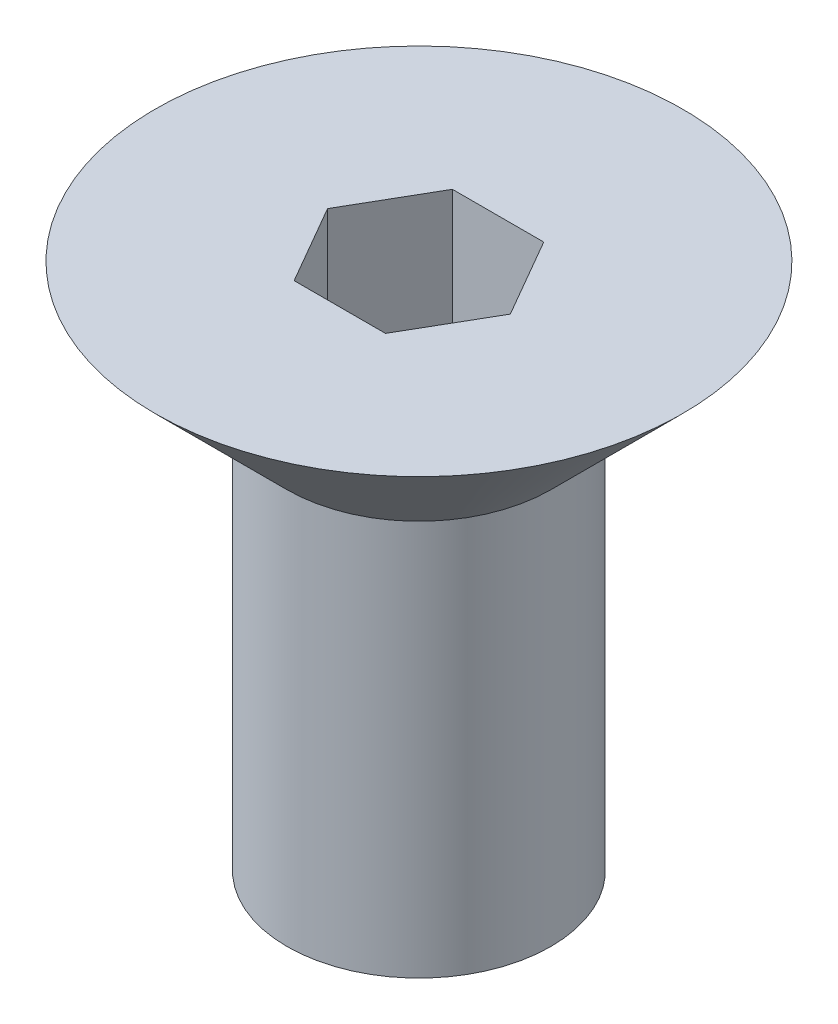
ISO-10303-21;
HEADER;
FILE_DESCRIPTION(('STEP AP214'),'2;1');
FILE_NAME('part.step','',(''),(''),'','','');
FILE_SCHEMA(('AUTOMOTIVE_DESIGN { 1 0 10303 214 1 1 1 1 }'));
ENDSEC;
DATA;
#1=APPLICATION_CONTEXT('core data for automotive mechanical design processes');
#2=APPLICATION_PROTOCOL_DEFINITION('international standard','automotive_design',2000,#1);
#3=PRODUCT_CONTEXT('',#1,'mechanical');
#4=PRODUCT('Part','Part','',(#3));
#5=PRODUCT_RELATED_PRODUCT_CATEGORY('part','',(#4));
#6=PRODUCT_DEFINITION_FORMATION('','',#4);
#7=PRODUCT_DEFINITION_CONTEXT('part definition',#1,'design');
#8=PRODUCT_DEFINITION('design','',#6,#7);
#9=PRODUCT_DEFINITION_SHAPE('','',#8);
#10=(LENGTH_UNIT() NAMED_UNIT(*) SI_UNIT(.MILLI.,.METRE.));
#11=(NAMED_UNIT(*) PLANE_ANGLE_UNIT() SI_UNIT($,.RADIAN.));
#12=(NAMED_UNIT(*) SI_UNIT($,.STERADIAN.) SOLID_ANGLE_UNIT());
#13=UNCERTAINTY_MEASURE_WITH_UNIT(LENGTH_MEASURE(1.E-05),#10,'distance_accuracy_value','');
#14=(GEOMETRIC_REPRESENTATION_CONTEXT(3) GLOBAL_UNCERTAINTY_ASSIGNED_CONTEXT((#13)) GLOBAL_UNIT_ASSIGNED_CONTEXT((#10,
#11,#12)) REPRESENTATION_CONTEXT('',''));
#15=CARTESIAN_POINT('',(0.,0.,0.));
#16=DIRECTION('',(0.,0.,1.));
#17=DIRECTION('',(1.,0.,0.));
#18=AXIS2_PLACEMENT_3D('',#15,#16,#17);
#19=CARTESIAN_POINT('',(0.,-10.,0.));
#20=DIRECTION('',(0.,1.,0.));
#21=DIRECTION('',(0.,0.,1.));
#22=AXIS2_PLACEMENT_3D('',#19,#20,#21);
#23=PLANE('',#22);
#24=CARTESIAN_POINT('',(0.,-9.99999999999999,0.));
#25=DIRECTION('',(0.,1.,0.));
#26=DIRECTION('',(0.,0.,1.));
#27=AXIS2_PLACEMENT_3D('',#24,#25,#26);
#28=CIRCLE('',#27,2.50000000000001);
#29=CARTESIAN_POINT('',(0.,-9.99999999999999,2.50000000000001));
#30=VERTEX_POINT('',#29);
#31=EDGE_CURVE('E11',#30,#30,#28,.T.);
#32=ORIENTED_EDGE('',*,*,#31,.F.);
#33=EDGE_LOOP('',(#32));
#34=FACE_BOUND('',#33,.T.);
#35=ADVANCED_FACE('F35',(#34),#23,.F.);
#36=CARTESIAN_POINT('',(0.,61.6916426261037,0.));
#37=DIRECTION('',(0.,1.,0.));
#38=DIRECTION('',(0.,0.,1.));
#39=AXIS2_PLACEMENT_3D('',#36,#37,#38);
#40=CYLINDRICAL_SURFACE('',#39,2.50000000000001);
#41=CARTESIAN_POINT('',(0.,-2.50000000000002,0.));
#42=DIRECTION('',(0.,1.,0.));
#43=DIRECTION('',(0.,0.,1.));
#44=AXIS2_PLACEMENT_3D('',#41,#42,#43);
#45=CIRCLE('',#44,2.50000000000001);
#46=CARTESIAN_POINT('',(0.,-2.50000000000002,2.50000000000001));
#47=VERTEX_POINT('',#46);
#48=EDGE_CURVE('E42',#47,#47,#45,.T.);
#49=ORIENTED_EDGE('',*,*,#48,.F.);
#50=EDGE_LOOP('',(#49));
#51=FACE_BOUND('',#50,.T.);
#52=ORIENTED_EDGE('',*,*,#31,.T.);
#53=EDGE_LOOP('',(#52));
#54=FACE_BOUND('',#53,.T.);
#55=ADVANCED_FACE('F148',(#51,#54),#40,.T.);
#56=CARTESIAN_POINT('',(0.,-2.50000000000002,0.));
#57=DIRECTION('',(0.,1.,0.));
#58=DIRECTION('',(0.,0.,1.));
#59=AXIS2_PLACEMENT_3D('',#56,#57,#58);
#60=CONICAL_SURFACE('',#59,2.50000000000001,0.785398163397445);
#61=CARTESIAN_POINT('',(0.,0.,0.));
#62=DIRECTION('',(0.,1.,0.));
#63=DIRECTION('',(0.,0.,1.));
#64=AXIS2_PLACEMENT_3D('',#61,#62,#63);
#65=CIRCLE('',#64,5.00000000000001);
#66=CARTESIAN_POINT('',(0.,0.,5.00000000000001));
#67=VERTEX_POINT('',#66);
#68=EDGE_CURVE('E136',#67,#67,#65,.T.);
#69=ORIENTED_EDGE('',*,*,#68,.F.);
#70=EDGE_LOOP('',(#69));
#71=FACE_BOUND('',#70,.T.);
#72=ORIENTED_EDGE('',*,*,#48,.T.);
#73=EDGE_LOOP('',(#72));
#74=FACE_BOUND('',#73,.T.);
#75=ADVANCED_FACE('F146',(#71,#74),#60,.T.);
#76=CARTESIAN_POINT('',(5.00000000000001,0.,0.));
#77=DIRECTION('',(0.,-1.,0.));
#78=DIRECTION('',(0.,0.,-1.));
#79=AXIS2_PLACEMENT_3D('',#76,#77,#78);
#80=PLANE('',#79);
#81=DIRECTION('',(-1.,0.,0.));
#82=VECTOR('',#81,1.);
#83=CARTESIAN_POINT('',(0.866025403784438,0.,-1.5));
#84=LINE('',#83,#82);
#85=CARTESIAN_POINT('',(0.866025403784438,0.,-1.5));
#86=VERTEX_POINT('',#85);
#87=CARTESIAN_POINT('',(-0.866025403784438,0.,-1.5));
#88=VERTEX_POINT('',#87);
#89=EDGE_CURVE('E123',#86,#88,#84,.T.);
#90=ORIENTED_EDGE('',*,*,#89,.F.);
#91=DIRECTION('',(-0.5,0.,-0.866025403784439));
#92=VECTOR('',#91,1.);
#93=CARTESIAN_POINT('',(1.73205080756888,0.,0.));
#94=LINE('',#93,#92);
#95=CARTESIAN_POINT('',(1.73205080756888,0.,0.));
#96=VERTEX_POINT('',#95);
#97=EDGE_CURVE('E49',#96,#86,#94,.T.);
#98=ORIENTED_EDGE('',*,*,#97,.F.);
#99=DIRECTION('',(0.5,0.,-0.866025403784439));
#100=VECTOR('',#99,1.);
#101=CARTESIAN_POINT('',(0.866025403784439,0.,1.5));
#102=LINE('',#101,#100);
#103=CARTESIAN_POINT('',(0.866025403784439,0.,1.5));
#104=VERTEX_POINT('',#103);
#105=EDGE_CURVE('E132',#104,#96,#102,.T.);
#106=ORIENTED_EDGE('',*,*,#105,.F.);
#107=DIRECTION('',(1.,0.,0.));
#108=VECTOR('',#107,1.);
#109=CARTESIAN_POINT('',(-0.866025403784438,0.,1.5));
#110=LINE('',#109,#108);
#111=CARTESIAN_POINT('',(-0.866025403784438,0.,1.5));
#112=VERTEX_POINT('',#111);
#113=EDGE_CURVE('E130',#112,#104,#110,.T.);
#114=ORIENTED_EDGE('',*,*,#113,.F.);
#115=DIRECTION('',(0.5,0.,0.866025403784439));
#116=VECTOR('',#115,1.);
#117=CARTESIAN_POINT('',(-1.73205080756888,0.,0.));
#118=LINE('',#117,#116);
#119=CARTESIAN_POINT('',(-1.73205080756888,0.,0.));
#120=VERTEX_POINT('',#119);
#121=EDGE_CURVE('E97',#120,#112,#118,.T.);
#122=ORIENTED_EDGE('',*,*,#121,.F.);
#123=DIRECTION('',(-0.5,0.,0.866025403784439));
#124=VECTOR('',#123,1.);
#125=CARTESIAN_POINT('',(-0.866025403784438,0.,-1.5));
#126=LINE('',#125,#124);
#127=EDGE_CURVE('E126',#88,#120,#126,.T.);
#128=ORIENTED_EDGE('',*,*,#127,.F.);
#129=EDGE_LOOP('',(#90,#98,#106,#114,#122,#128));
#130=FACE_BOUND('',#129,.T.);
#131=ORIENTED_EDGE('',*,*,#68,.T.);
#132=EDGE_LOOP('',(#131));
#133=FACE_BOUND('',#132,.T.);
#134=ADVANCED_FACE('F166',(#130,#133),#80,.F.);
#135=CARTESIAN_POINT('',(1.73205080756888,-2.5,0.));
#136=DIRECTION('',(0.866025403784439,0.,-0.5));
#137=DIRECTION('',(-0.5,0.,-0.866025403784439));
#138=AXIS2_PLACEMENT_3D('',#135,#136,#137);
#139=PLANE('',#138);
#140=ORIENTED_EDGE('',*,*,#97,.T.);
#141=DIRECTION('',(0.,1.,0.));
#142=VECTOR('',#141,1.);
#143=CARTESIAN_POINT('',(0.866025403784438,-2.5,-1.5));
#144=LINE('',#143,#142);
#145=CARTESIAN_POINT('',(0.866025403784438,-2.5,-1.5));
#146=VERTEX_POINT('',#145);
#147=EDGE_CURVE('E79',#146,#86,#144,.T.);
#148=ORIENTED_EDGE('',*,*,#147,.F.);
#149=DIRECTION('',(-0.5,0.,-0.866025403784439));
#150=VECTOR('',#149,1.);
#151=CARTESIAN_POINT('',(1.73205080756888,-2.5,0.));
#152=LINE('',#151,#150);
#153=CARTESIAN_POINT('',(1.73205080756888,-2.5,0.));
#154=VERTEX_POINT('',#153);
#155=EDGE_CURVE('E134',#154,#146,#152,.T.);
#156=ORIENTED_EDGE('',*,*,#155,.F.);
#157=DIRECTION('',(0.,1.,0.));
#158=VECTOR('',#157,1.);
#159=CARTESIAN_POINT('',(1.73205080756888,-2.5,0.));
#160=LINE('',#159,#158);
#161=EDGE_CURVE('E57',#154,#96,#160,.T.);
#162=ORIENTED_EDGE('',*,*,#161,.T.);
#163=EDGE_LOOP('',(#140,#148,#156,#162));
#164=FACE_BOUND('',#163,.T.);
#165=ADVANCED_FACE('F174',(#164),#139,.F.);
#166=CARTESIAN_POINT('',(0.866025403784439,-2.5,1.5));
#167=DIRECTION('',(0.866025403784439,0.,0.5));
#168=DIRECTION('',(0.5,0.,-0.866025403784439));
#169=AXIS2_PLACEMENT_3D('',#166,#167,#168);
#170=PLANE('',#169);
#171=ORIENTED_EDGE('',*,*,#105,.T.);
#172=ORIENTED_EDGE('',*,*,#161,.F.);
#173=DIRECTION('',(0.5,0.,-0.866025403784439));
#174=VECTOR('',#173,1.);
#175=CARTESIAN_POINT('',(0.866025403784439,-2.5,1.5));
#176=LINE('',#175,#174);
#177=CARTESIAN_POINT('',(0.866025403784439,-2.5,1.5));
#178=VERTEX_POINT('',#177);
#179=EDGE_CURVE('E109',#178,#154,#176,.T.);
#180=ORIENTED_EDGE('',*,*,#179,.F.);
#181=DIRECTION('',(0.,1.,0.));
#182=VECTOR('',#181,1.);
#183=CARTESIAN_POINT('',(0.866025403784439,-2.5,1.5));
#184=LINE('',#183,#182);
#185=EDGE_CURVE('E101',#178,#104,#184,.T.);
#186=ORIENTED_EDGE('',*,*,#185,.T.);
#187=EDGE_LOOP('',(#171,#172,#180,#186));
#188=FACE_BOUND('',#187,.T.);
#189=ADVANCED_FACE('F182',(#188),#170,.F.);
#190=CARTESIAN_POINT('',(-0.866025403784438,-2.5,1.5));
#191=DIRECTION('',(0.,0.,1.));
#192=DIRECTION('',(1.,0.,0.));
#193=AXIS2_PLACEMENT_3D('',#190,#191,#192);
#194=PLANE('',#193);
#195=ORIENTED_EDGE('',*,*,#113,.T.);
#196=ORIENTED_EDGE('',*,*,#185,.F.);
#197=DIRECTION('',(1.,0.,0.));
#198=VECTOR('',#197,1.);
#199=CARTESIAN_POINT('',(-0.866025403784438,-2.5,1.5));
#200=LINE('',#199,#198);
#201=CARTESIAN_POINT('',(-0.866025403784438,-2.5,1.5));
#202=VERTEX_POINT('',#201);
#203=EDGE_CURVE('E105',#202,#178,#200,.T.);
#204=ORIENTED_EDGE('',*,*,#203,.F.);
#205=DIRECTION('',(0.,1.,0.));
#206=VECTOR('',#205,1.);
#207=CARTESIAN_POINT('',(-0.866025403784438,-2.5,1.5));
#208=LINE('',#207,#206);
#209=EDGE_CURVE('E90',#202,#112,#208,.T.);
#210=ORIENTED_EDGE('',*,*,#209,.T.);
#211=EDGE_LOOP('',(#195,#196,#204,#210));
#212=FACE_BOUND('',#211,.T.);
#213=ADVANCED_FACE('F106',(#212),#194,.F.);
#214=CARTESIAN_POINT('',(-1.73205080756888,-2.5,0.));
#215=DIRECTION('',(-0.866025403784438,0.,0.5));
#216=DIRECTION('',(0.5,0.,0.866025403784438));
#217=AXIS2_PLACEMENT_3D('',#214,#215,#216);
#218=PLANE('',#217);
#219=ORIENTED_EDGE('',*,*,#121,.T.);
#220=ORIENTED_EDGE('',*,*,#209,.F.);
#221=DIRECTION('',(0.5,0.,0.866025403784439));
#222=VECTOR('',#221,1.);
#223=CARTESIAN_POINT('',(-1.73205080756888,-2.5,0.));
#224=LINE('',#223,#222);
#225=CARTESIAN_POINT('',(-1.73205080756888,-2.5,0.));
#226=VERTEX_POINT('',#225);
#227=EDGE_CURVE('E94',#226,#202,#224,.T.);
#228=ORIENTED_EDGE('',*,*,#227,.F.);
#229=DIRECTION('',(0.,1.,0.));
#230=VECTOR('',#229,1.);
#231=CARTESIAN_POINT('',(-1.73205080756888,-2.5,0.));
#232=LINE('',#231,#230);
#233=EDGE_CURVE('E102',#226,#120,#232,.T.);
#234=ORIENTED_EDGE('',*,*,#233,.T.);
#235=EDGE_LOOP('',(#219,#220,#228,#234));
#236=FACE_BOUND('',#235,.T.);
#237=ADVANCED_FACE('F92',(#236),#218,.F.);
#238=CARTESIAN_POINT('',(-0.866025403784438,-2.5,-1.5));
#239=DIRECTION('',(-0.866025403784439,0.,-0.5));
#240=DIRECTION('',(-0.5,0.,0.866025403784439));
#241=AXIS2_PLACEMENT_3D('',#238,#239,#240);
#242=PLANE('',#241);
#243=ORIENTED_EDGE('',*,*,#127,.T.);
#244=ORIENTED_EDGE('',*,*,#233,.F.);
#245=DIRECTION('',(-0.5,0.,0.866025403784439));
#246=VECTOR('',#245,1.);
#247=CARTESIAN_POINT('',(-0.866025403784438,-2.5,-1.5));
#248=LINE('',#247,#246);
#249=CARTESIAN_POINT('',(-0.866025403784438,-2.5,-1.5));
#250=VERTEX_POINT('',#249);
#251=EDGE_CURVE('E115',#250,#226,#248,.T.);
#252=ORIENTED_EDGE('',*,*,#251,.F.);
#253=DIRECTION('',(0.,1.,0.));
#254=VECTOR('',#253,1.);
#255=CARTESIAN_POINT('',(-0.866025403784438,-2.5,-1.5));
#256=LINE('',#255,#254);
#257=EDGE_CURVE('E139',#250,#88,#256,.T.);
#258=ORIENTED_EDGE('',*,*,#257,.T.);
#259=EDGE_LOOP('',(#243,#244,#252,#258));
#260=FACE_BOUND('',#259,.T.);
#261=ADVANCED_FACE('F201',(#260),#242,.F.);
#262=CARTESIAN_POINT('',(0.866025403784438,-2.5,-1.5));
#263=DIRECTION('',(0.,0.,-1.));
#264=DIRECTION('',(-1.,0.,0.));
#265=AXIS2_PLACEMENT_3D('',#262,#263,#264);
#266=PLANE('',#265);
#267=ORIENTED_EDGE('',*,*,#89,.T.);
#268=ORIENTED_EDGE('',*,*,#257,.F.);
#269=DIRECTION('',(-1.,0.,0.));
#270=VECTOR('',#269,1.);
#271=CARTESIAN_POINT('',(0.866025403784438,-2.5,-1.5));
#272=LINE('',#271,#270);
#273=EDGE_CURVE('E117',#146,#250,#272,.T.);
#274=ORIENTED_EDGE('',*,*,#273,.F.);
#275=ORIENTED_EDGE('',*,*,#147,.T.);
#276=EDGE_LOOP('',(#267,#268,#274,#275));
#277=FACE_BOUND('',#276,.T.);
#278=ADVANCED_FACE('F208',(#277),#266,.F.);
#279=CARTESIAN_POINT('',(1.73205080756888,-2.5,0.));
#280=DIRECTION('',(0.,-1.,0.));
#281=DIRECTION('',(0.,0.,-1.));
#282=AXIS2_PLACEMENT_3D('',#279,#280,#281);
#283=PLANE('',#282);
#284=ORIENTED_EDGE('',*,*,#155,.T.);
#285=ORIENTED_EDGE('',*,*,#273,.T.);
#286=ORIENTED_EDGE('',*,*,#251,.T.);
#287=ORIENTED_EDGE('',*,*,#227,.T.);
#288=ORIENTED_EDGE('',*,*,#203,.T.);
#289=ORIENTED_EDGE('',*,*,#179,.T.);
#290=EDGE_LOOP('',(#284,#285,#286,#287,#288,#289));
#291=FACE_BOUND('',#290,.T.);
#292=ADVANCED_FACE('F112',(#291),#283,.F.);
#293=CLOSED_SHELL('',(#35,#55,#75,#134,#165,#189,#213,#237,#261,#278,#292));
#294=MANIFOLD_SOLID_BREP('B2',#293);
#295=ADVANCED_BREP_SHAPE_REPRESENTATION('',(#18,#294),#14);
#296=SHAPE_DEFINITION_REPRESENTATION(#9,#295);
ENDSEC;
END-ISO-10303-21;
